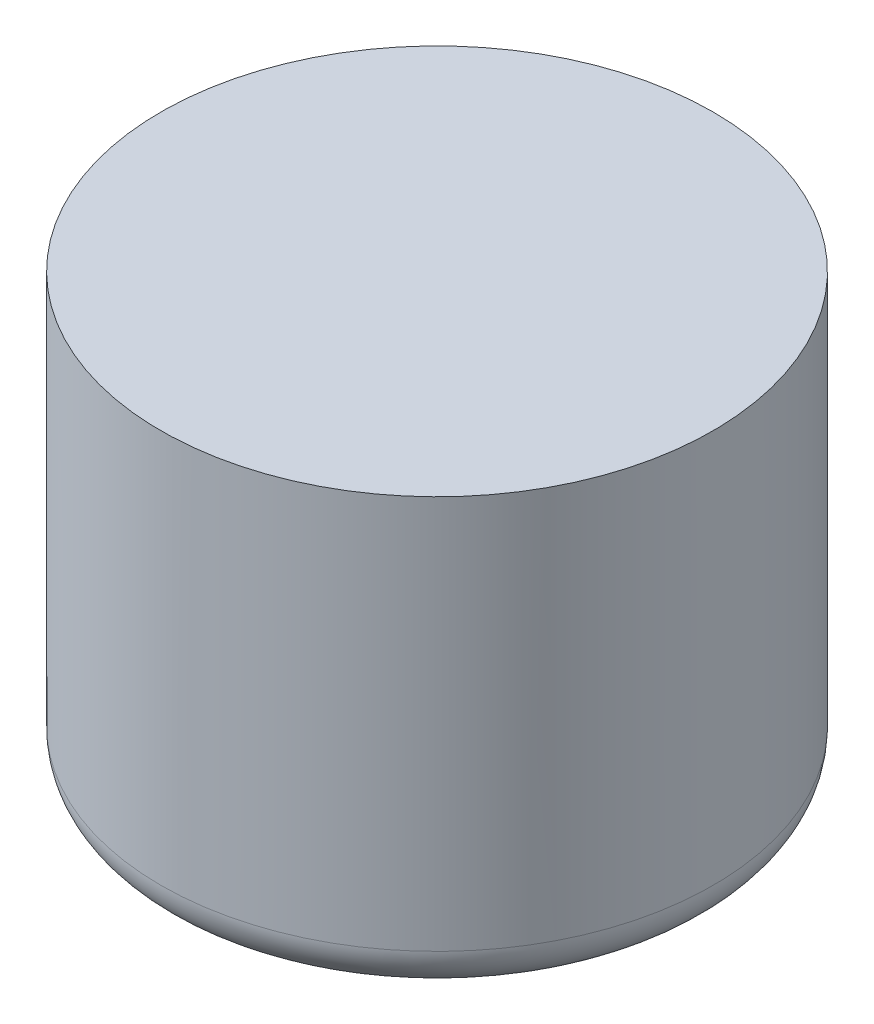
ISO-10303-21;
HEADER;
FILE_DESCRIPTION(('STEP AP214'),'2;1');
FILE_NAME('part.step','',(''),(''),'','','');
FILE_SCHEMA(('AUTOMOTIVE_DESIGN { 1 0 10303 214 1 1 1 1 }'));
ENDSEC;
DATA;
#1=APPLICATION_CONTEXT('core data for automotive mechanical design processes');
#2=APPLICATION_PROTOCOL_DEFINITION('international standard','automotive_design',2000,#1);
#3=PRODUCT_CONTEXT('',#1,'mechanical');
#4=PRODUCT('Part','Part','',(#3));
#5=PRODUCT_RELATED_PRODUCT_CATEGORY('part','',(#4));
#6=PRODUCT_DEFINITION_FORMATION('','',#4);
#7=PRODUCT_DEFINITION_CONTEXT('part definition',#1,'design');
#8=PRODUCT_DEFINITION('design','',#6,#7);
#9=PRODUCT_DEFINITION_SHAPE('','',#8);
#10=(LENGTH_UNIT() NAMED_UNIT(*) SI_UNIT(.MILLI.,.METRE.));
#11=(NAMED_UNIT(*) PLANE_ANGLE_UNIT() SI_UNIT($,.RADIAN.));
#12=(NAMED_UNIT(*) SI_UNIT($,.STERADIAN.) SOLID_ANGLE_UNIT());
#13=UNCERTAINTY_MEASURE_WITH_UNIT(LENGTH_MEASURE(1.E-05),#10,'distance_accuracy_value','');
#14=(GEOMETRIC_REPRESENTATION_CONTEXT(3) GLOBAL_UNCERTAINTY_ASSIGNED_CONTEXT((#13)) GLOBAL_UNIT_ASSIGNED_CONTEXT((#10,
#11,#12)) REPRESENTATION_CONTEXT('',''));
#15=CARTESIAN_POINT('',(0.,0.,0.));
#16=DIRECTION('',(0.,0.,1.));
#17=DIRECTION('',(1.,0.,0.));
#18=AXIS2_PLACEMENT_3D('',#15,#16,#17);
#19=CARTESIAN_POINT('',(0.,49.9999,0.));
#20=DIRECTION('',(0.,-1.,0.));
#21=DIRECTION('',(0.,0.,-1.));
#22=AXIS2_PLACEMENT_3D('',#19,#20,#21);
#23=CYLINDRICAL_SURFACE('',#22,31.499937);
#24=CARTESIAN_POINT('',(0.,5.08,0.));
#25=DIRECTION('',(0.,1.,0.));
#26=DIRECTION('',(0.,0.,1.));
#27=AXIS2_PLACEMENT_3D('',#24,#25,#26);
#28=CIRCLE('',#27,31.499937);
#29=CARTESIAN_POINT('',(0.,5.07999999999999,-31.499937));
#30=VERTEX_POINT('',#29);
#31=EDGE_CURVE('E45',#30,#30,#28,.T.);
#32=CARTESIAN_POINT('',(0.,49.9999,0.));
#33=DIRECTION('',(0.,1.,0.));
#34=DIRECTION('',(0.,0.,1.));
#35=AXIS2_PLACEMENT_3D('',#32,#33,#34);
#36=CIRCLE('',#35,31.499937);
#37=CARTESIAN_POINT('',(0.,49.9999,-31.499937));
#38=VERTEX_POINT('',#37);
#39=EDGE_CURVE('E50',#38,#38,#36,.T.);
#40=CARTESIAN_POINT('',(0.,5.07999999999999,-31.499937));
#41=CARTESIAN_POINT('',(0.,5.54791562499999,-31.499937));
#42=CARTESIAN_POINT('',(0.,6.01583124999999,-31.499937));
#43=CARTESIAN_POINT('',(0.,6.95166249999999,-31.499937));
#44=CARTESIAN_POINT('',(0.,7.41957812499999,-31.499937));
#45=CARTESIAN_POINT('',(0.,8.355409375,-31.499937));
#46=CARTESIAN_POINT('',(0.,8.823325,-31.499937));
#47=CARTESIAN_POINT('',(0.,9.75915625,-31.499937));
#48=CARTESIAN_POINT('',(0.,10.227071875,-31.499937));
#49=CARTESIAN_POINT('',(0.,11.162903125,-31.499937));
#50=CARTESIAN_POINT('',(0.,11.63081875,-31.499937));
#51=CARTESIAN_POINT('',(0.,12.56665,-31.499937));
#52=CARTESIAN_POINT('',(0.,13.034565625,-31.499937));
#53=CARTESIAN_POINT('',(0.,13.970396875,-31.499937));
#54=CARTESIAN_POINT('',(0.,14.4383125,-31.499937));
#55=CARTESIAN_POINT('',(0.,15.37414375,-31.499937));
#56=CARTESIAN_POINT('',(0.,15.842059375,-31.499937));
#57=CARTESIAN_POINT('',(0.,16.777890625,-31.499937));
#58=CARTESIAN_POINT('',(0.,17.24580625,-31.499937));
#59=CARTESIAN_POINT('',(0.,18.1816375,-31.499937));
#60=CARTESIAN_POINT('',(0.,18.649553125,-31.499937));
#61=CARTESIAN_POINT('',(0.,19.585384375,-31.499937));
#62=CARTESIAN_POINT('',(0.,20.0533,-31.499937));
#63=CARTESIAN_POINT('',(0.,20.98913125,-31.499937));
#64=CARTESIAN_POINT('',(0.,21.457046875,-31.499937));
#65=CARTESIAN_POINT('',(0.,22.392878125,-31.499937));
#66=CARTESIAN_POINT('',(0.,22.86079375,-31.499937));
#67=CARTESIAN_POINT('',(0.,23.796625,-31.499937));
#68=CARTESIAN_POINT('',(0.,24.264540625,-31.499937));
#69=CARTESIAN_POINT('',(0.,25.200371875,-31.499937));
#70=CARTESIAN_POINT('',(0.,25.6682875,-31.499937));
#71=CARTESIAN_POINT('',(0.,26.60411875,-31.499937));
#72=CARTESIAN_POINT('',(0.,27.072034375,-31.499937));
#73=CARTESIAN_POINT('',(0.,28.007865625,-31.499937));
#74=CARTESIAN_POINT('',(0.,28.47578125,-31.499937));
#75=CARTESIAN_POINT('',(0.,29.4116125,-31.499937));
#76=CARTESIAN_POINT('',(0.,29.879528125,-31.499937));
#77=CARTESIAN_POINT('',(0.,30.815359375,-31.499937));
#78=CARTESIAN_POINT('',(0.,31.283275,-31.499937));
#79=CARTESIAN_POINT('',(0.,32.21910625,-31.499937));
#80=CARTESIAN_POINT('',(0.,32.687021875,-31.499937));
#81=CARTESIAN_POINT('',(0.,33.622853125,-31.499937));
#82=CARTESIAN_POINT('',(0.,34.09076875,-31.499937));
#83=CARTESIAN_POINT('',(0.,35.0266,-31.499937));
#84=CARTESIAN_POINT('',(0.,35.494515625,-31.499937));
#85=CARTESIAN_POINT('',(0.,36.430346875,-31.499937));
#86=CARTESIAN_POINT('',(0.,36.8982625,-31.499937));
#87=CARTESIAN_POINT('',(0.,37.83409375,-31.499937));
#88=CARTESIAN_POINT('',(0.,38.302009375,-31.499937));
#89=CARTESIAN_POINT('',(0.,39.237840625,-31.499937));
#90=CARTESIAN_POINT('',(0.,39.70575625,-31.499937));
#91=CARTESIAN_POINT('',(0.,40.6415875,-31.499937));
#92=CARTESIAN_POINT('',(0.,41.109503125,-31.499937));
#93=CARTESIAN_POINT('',(0.,42.045334375,-31.499937));
#94=CARTESIAN_POINT('',(0.,42.51325,-31.499937));
#95=CARTESIAN_POINT('',(0.,43.44908125,-31.499937));
#96=CARTESIAN_POINT('',(0.,43.916996875,-31.499937));
#97=CARTESIAN_POINT('',(0.,44.852828125,-31.499937));
#98=CARTESIAN_POINT('',(0.,45.32074375,-31.499937));
#99=CARTESIAN_POINT('',(0.,46.256575,-31.499937));
#100=CARTESIAN_POINT('',(0.,46.724490625,-31.499937));
#101=CARTESIAN_POINT('',(0.,47.660321875,-31.499937));
#102=CARTESIAN_POINT('',(0.,48.1282375,-31.499937));
#103=CARTESIAN_POINT('',(0.,49.06406875,-31.499937));
#104=CARTESIAN_POINT('',(0.,49.531984375,-31.499937));
#105=CARTESIAN_POINT('',(0.,49.9999,-31.499937));
#106=B_SPLINE_CURVE_WITH_KNOTS('',3,(#40,#41,#42,#43,#44,#45,#46,#47,#48,#49,#50,#51,#52,#53,
#54,#55,#56,#57,#58,#59,#60,#61,#62,#63,#64,#65,#66,#67,#68,#69,#70,#71,#72,#73,#74,#75,#76,#77,
#78,#79,#80,#81,#82,#83,#84,#85,#86,#87,#88,#89,#90,#91,#92,#93,#94,#95,#96,#97,#98,#99,#100,
#101,#102,#103,#104,#105),.UNSPECIFIED.,.F.,.F.,(4,2,2,2,2,2,2,2,2,2,2,2,2,2,2,2,2,2,2,2,2,2,2,
2,2,2,2,2,2,2,2,2,4),(0.,1.403746875,2.80749375,4.211240625,5.6149875,7.018734375,8.42248125,
9.826228125,11.229975,12.633721875,14.03746875,15.441215625,16.8449625,18.248709375,19.65245625,
21.056203125,22.45995,23.863696875,25.26744375,26.671190625,28.0749375,29.478684375,30.88243125,
32.286178125,33.689925,35.093671875,36.49741875,37.901165625,39.3049125,40.708659375,
42.11240625,43.516153125,44.9199),.UNSPECIFIED.);
#107=EDGE_CURVE('BSEAM37',#30,#38,#106,.T.);
#108=ORIENTED_EDGE('',*,*,#31,.T.);
#109=ORIENTED_EDGE('',*,*,#39,.F.);
#110=ORIENTED_EDGE('',*,*,#107,.T.);
#111=ORIENTED_EDGE('',*,*,#107,.F.);
#112=EDGE_LOOP('',(#108,#110,#109,#111));
#113=FACE_BOUND('',#112,.T.);
#114=ADVANCED_FACE('F37',(#113),#23,.T.);
#115=CARTESIAN_POINT('',(0.,49.9999,0.));
#116=DIRECTION('',(0.,1.,0.));
#117=DIRECTION('',(0.,0.,1.));
#118=AXIS2_PLACEMENT_3D('',#115,#116,#117);
#119=PLANE('',#118);
#120=ORIENTED_EDGE('',*,*,#39,.T.);
#121=EDGE_LOOP('',(#120));
#122=FACE_BOUND('',#121,.T.);
#123=ADVANCED_FACE('F58',(#122),#119,.T.);
#124=CARTESIAN_POINT('',(0.,0.,0.));
#125=DIRECTION('',(0.,1.,0.));
#126=DIRECTION('',(0.,0.,1.));
#127=AXIS2_PLACEMENT_3D('',#124,#125,#126);
#128=PLANE('',#127);
#129=CARTESIAN_POINT('',(0.,0.,0.));
#130=DIRECTION('',(0.,1.,0.));
#131=DIRECTION('',(0.,0.,1.));
#132=AXIS2_PLACEMENT_3D('',#129,#130,#131);
#133=CIRCLE('',#132,26.419937);
#134=CARTESIAN_POINT('',(0.,0.,26.419937));
#135=VERTEX_POINT('',#134);
#136=EDGE_CURVE('E10',#135,#135,#133,.F.);
#137=ORIENTED_EDGE('',*,*,#136,.T.);
#138=EDGE_LOOP('',(#137));
#139=FACE_BOUND('',#138,.T.);
#140=ADVANCED_FACE('F64',(#139),#128,.F.);
#141=CARTESIAN_POINT('',(0.,5.08,0.));
#142=DIRECTION('',(0.,1.,0.));
#143=DIRECTION('',(0.,0.,1.));
#144=AXIS2_PLACEMENT_3D('',#141,#142,#143);
#145=TOROIDAL_SURFACE('',#144,26.419937,5.08);
#146=ORIENTED_EDGE('',*,*,#136,.F.);
#147=EDGE_LOOP('',(#146));
#148=FACE_BOUND('',#147,.T.);
#149=ORIENTED_EDGE('',*,*,#31,.F.);
#150=EDGE_LOOP('',(#149));
#151=FACE_BOUND('',#150,.T.);
#152=ADVANCED_FACE('F39',(#148,#151),#145,.T.);
#153=CLOSED_SHELL('',(#114,#123,#140,#152));
#154=MANIFOLD_SOLID_BREP('B2',#153);
#155=ADVANCED_BREP_SHAPE_REPRESENTATION('',(#18,#154),#14);
#156=SHAPE_DEFINITION_REPRESENTATION(#9,#155);
ENDSEC;
END-ISO-10303-21;
